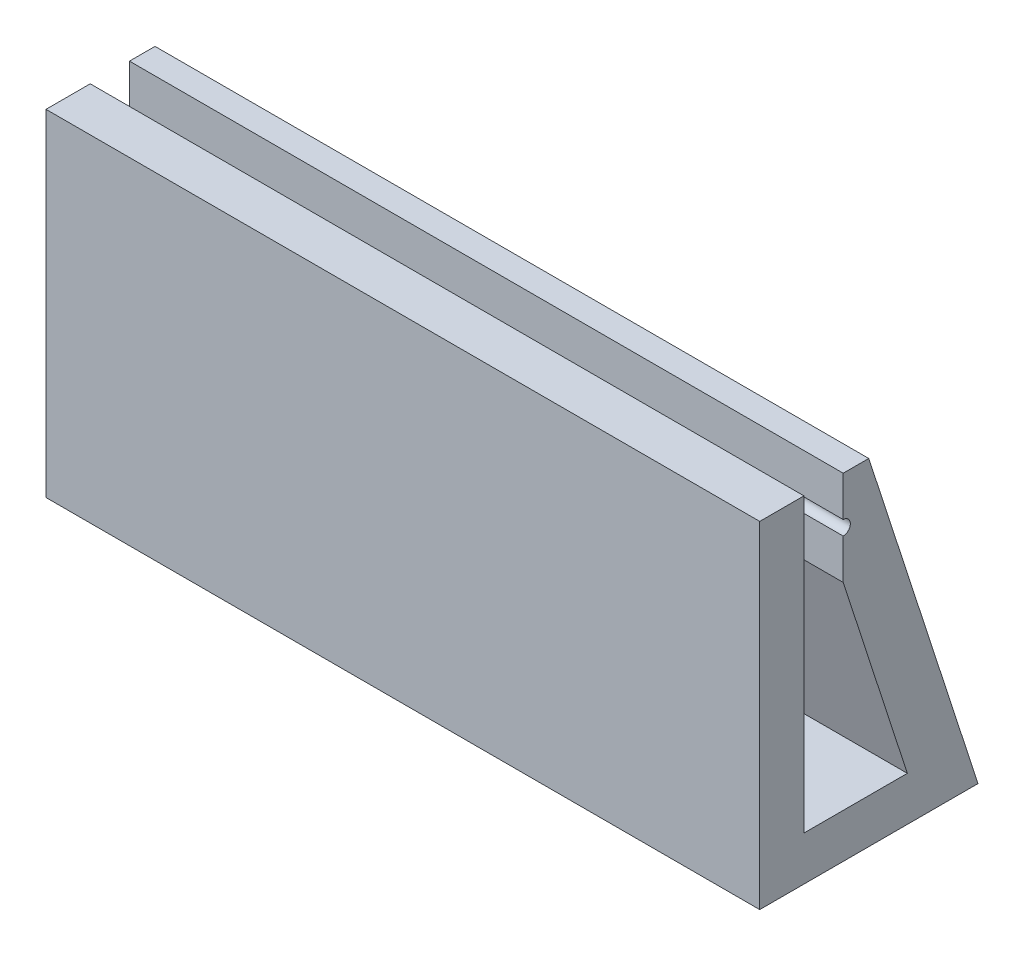
ISO-10303-21;
HEADER;
FILE_DESCRIPTION(('STEP AP214'),'2;1');
FILE_NAME('part.step','',(''),(''),'','','');
FILE_SCHEMA(('AUTOMOTIVE_DESIGN { 1 0 10303 214 1 1 1 1 }'));
ENDSEC;
DATA;
#1=APPLICATION_CONTEXT('core data for automotive mechanical design processes');
#2=APPLICATION_PROTOCOL_DEFINITION('international standard','automotive_design',2000,#1);
#3=PRODUCT_CONTEXT('',#1,'mechanical');
#4=PRODUCT('Part','Part','',(#3));
#5=PRODUCT_RELATED_PRODUCT_CATEGORY('part','',(#4));
#6=PRODUCT_DEFINITION_FORMATION('','',#4);
#7=PRODUCT_DEFINITION_CONTEXT('part definition',#1,'design');
#8=PRODUCT_DEFINITION('design','',#6,#7);
#9=PRODUCT_DEFINITION_SHAPE('','',#8);
#10=(LENGTH_UNIT() NAMED_UNIT(*) SI_UNIT(.MILLI.,.METRE.));
#11=(NAMED_UNIT(*) PLANE_ANGLE_UNIT() SI_UNIT($,.RADIAN.));
#12=(NAMED_UNIT(*) SI_UNIT($,.STERADIAN.) SOLID_ANGLE_UNIT());
#13=UNCERTAINTY_MEASURE_WITH_UNIT(LENGTH_MEASURE(1.E-05),#10,'distance_accuracy_value','');
#14=(GEOMETRIC_REPRESENTATION_CONTEXT(3) GLOBAL_UNCERTAINTY_ASSIGNED_CONTEXT((#13)) GLOBAL_UNIT_ASSIGNED_CONTEXT((#10,
#11,#12)) REPRESENTATION_CONTEXT('',''));
#15=CARTESIAN_POINT('',(0.,0.,0.));
#16=DIRECTION('',(0.,0.,1.));
#17=DIRECTION('',(1.,0.,0.));
#18=AXIS2_PLACEMENT_3D('',#15,#16,#17);
#19=CARTESIAN_POINT('',(10.,9.42163376503082,-2.33918131269569));
#20=DIRECTION('',(0.,1.,0.));
#21=DIRECTION('',(0.,0.,1.));
#22=AXIS2_PLACEMENT_3D('',#19,#20,#21);
#23=PLANE('',#22);
#24=DIRECTION('',(0.,0.,-1.));
#25=VECTOR('',#24,1.);
#26=CARTESIAN_POINT('',(-10.,9.42163376503082,-2.33918131269569));
#27=LINE('',#26,#25);
#28=CARTESIAN_POINT('',(-10.,9.42163376503082,-2.33918131269569));
#29=VERTEX_POINT('',#28);
#30=CARTESIAN_POINT('',(-10.,9.42163376503082,-3.05514481383585));
#31=VERTEX_POINT('',#30);
#32=EDGE_CURVE('E150',#29,#31,#27,.T.);
#33=ORIENTED_EDGE('',*,*,#32,.F.);
#34=DIRECTION('',(-1.,0.,0.));
#35=VECTOR('',#34,1.);
#36=CARTESIAN_POINT('',(10.,9.42163376503082,-2.33918131269569));
#37=LINE('',#36,#35);
#38=CARTESIAN_POINT('',(10.,9.42163376503082,-2.33918131269569));
#39=VERTEX_POINT('',#38);
#40=EDGE_CURVE('E11',#39,#29,#37,.T.);
#41=ORIENTED_EDGE('',*,*,#40,.F.);
#42=DIRECTION('',(0.,0.,-1.));
#43=VECTOR('',#42,1.);
#44=CARTESIAN_POINT('',(10.,9.42163376503082,-2.33918131269569));
#45=LINE('',#44,#43);
#46=CARTESIAN_POINT('',(10.,9.42163376503082,-3.05514481383585));
#47=VERTEX_POINT('',#46);
#48=EDGE_CURVE('E172',#39,#47,#45,.T.);
#49=ORIENTED_EDGE('',*,*,#48,.T.);
#50=DIRECTION('',(-1.,0.,0.));
#51=VECTOR('',#50,1.);
#52=CARTESIAN_POINT('',(10.,9.42163376503082,-3.05514481383585));
#53=LINE('',#52,#51);
#54=EDGE_CURVE('E37',#47,#31,#53,.T.);
#55=ORIENTED_EDGE('',*,*,#54,.T.);
#56=EDGE_LOOP('',(#33,#41,#49,#55));
#57=FACE_BOUND('',#56,.T.);
#58=ADVANCED_FACE('F34',(#57),#23,.T.);
#59=CARTESIAN_POINT('',(10.,9.42163376503082,-2.33918131269569));
#60=DIRECTION('',(0.,0.,-1.));
#61=DIRECTION('',(-1.,0.,0.));
#62=AXIS2_PLACEMENT_3D('',#59,#60,#61);
#63=PLANE('',#62);
#64=DIRECTION('',(0.,-1.,0.));
#65=VECTOR('',#64,1.);
#66=CARTESIAN_POINT('',(-10.,9.42163376503082,-2.33918131269569));
#67=LINE('',#66,#65);
#68=CARTESIAN_POINT('',(-10.,8.29633732224469,-2.33918131269569));
#69=VERTEX_POINT('',#68);
#70=EDGE_CURVE('E88',#29,#69,#67,.T.);
#71=ORIENTED_EDGE('',*,*,#70,.T.);
#72=DIRECTION('',(-1.,0.,0.));
#73=VECTOR('',#72,1.);
#74=CARTESIAN_POINT('',(10.,8.29633732224469,-2.33918131269569));
#75=LINE('',#74,#73);
#76=CARTESIAN_POINT('',(10.,8.29633732224469,-2.33918131269569));
#77=VERTEX_POINT('',#76);
#78=EDGE_CURVE('E43',#77,#69,#75,.T.);
#79=ORIENTED_EDGE('',*,*,#78,.F.);
#80=DIRECTION('',(0.,-1.,0.));
#81=VECTOR('',#80,1.);
#82=CARTESIAN_POINT('',(10.,9.42163376503082,-2.33918131269569));
#83=LINE('',#82,#81);
#84=EDGE_CURVE('E128',#39,#77,#83,.T.);
#85=ORIENTED_EDGE('',*,*,#84,.F.);
#86=ORIENTED_EDGE('',*,*,#40,.T.);
#87=EDGE_LOOP('',(#71,#79,#85,#86));
#88=FACE_BOUND('',#87,.T.);
#89=ADVANCED_FACE('F243',(#88),#63,.F.);
#90=CARTESIAN_POINT('',(10.,8.09633732224468,-2.33918131269569));
#91=DIRECTION('',(-1.,0.,0.));
#92=DIRECTION('',(0.,0.,1.));
#93=AXIS2_PLACEMENT_3D('',#90,#91,#92);
#94=CYLINDRICAL_SURFACE('',#93,0.200000000000001);
#95=CARTESIAN_POINT('',(-10.,8.09633732224468,-2.33918131269569));
#96=DIRECTION('',(-1.,0.,0.));
#97=DIRECTION('',(0.,0.,1.));
#98=AXIS2_PLACEMENT_3D('',#95,#96,#97);
#99=CIRCLE('',#98,0.200000000000001);
#100=CARTESIAN_POINT('',(-10.,7.89633732224468,-2.33918131269569));
#101=VERTEX_POINT('',#100);
#102=EDGE_CURVE('E135',#69,#101,#99,.T.);
#103=ORIENTED_EDGE('',*,*,#102,.T.);
#104=DIRECTION('',(-1.,0.,0.));
#105=VECTOR('',#104,1.);
#106=CARTESIAN_POINT('',(10.,7.89633732224468,-2.33918131269569));
#107=LINE('',#106,#105);
#108=CARTESIAN_POINT('',(10.,7.89633732224468,-2.33918131269569));
#109=VERTEX_POINT('',#108);
#110=EDGE_CURVE('E132',#109,#101,#107,.T.);
#111=ORIENTED_EDGE('',*,*,#110,.F.);
#112=CARTESIAN_POINT('',(10.,8.09633732224468,-2.33918131269569));
#113=DIRECTION('',(-1.,0.,0.));
#114=DIRECTION('',(0.,0.,1.));
#115=AXIS2_PLACEMENT_3D('',#112,#113,#114);
#116=CIRCLE('',#115,0.200000000000001);
#117=EDGE_CURVE('E121',#77,#109,#116,.T.);
#118=ORIENTED_EDGE('',*,*,#117,.F.);
#119=ORIENTED_EDGE('',*,*,#78,.T.);
#120=EDGE_LOOP('',(#103,#111,#118,#119));
#121=FACE_BOUND('',#120,.T.);
#122=ADVANCED_FACE('F133',(#121),#94,.F.);
#123=CARTESIAN_POINT('',(10.,7.89633732224468,-2.33918131269569));
#124=DIRECTION('',(0.,0.,-1.));
#125=DIRECTION('',(0.,1.,0.));
#126=AXIS2_PLACEMENT_3D('',#123,#124,#125);
#127=PLANE('',#126);
#128=DIRECTION('',(0.,-1.,0.));
#129=VECTOR('',#128,1.);
#130=CARTESIAN_POINT('',(-10.,7.89633732224468,-2.33918131269569));
#131=LINE('',#130,#129);
#132=CARTESIAN_POINT('',(-10.,6.77104087945855,-2.33918131269569));
#133=VERTEX_POINT('',#132);
#134=EDGE_CURVE('E169',#101,#133,#131,.T.);
#135=ORIENTED_EDGE('',*,*,#134,.T.);
#136=DIRECTION('',(-1.,0.,0.));
#137=VECTOR('',#136,1.);
#138=CARTESIAN_POINT('',(10.,6.77104087945855,-2.33918131269569));
#139=LINE('',#138,#137);
#140=CARTESIAN_POINT('',(10.,6.77104087945855,-2.33918131269569));
#141=VERTEX_POINT('',#140);
#142=EDGE_CURVE('E138',#141,#133,#139,.T.);
#143=ORIENTED_EDGE('',*,*,#142,.F.);
#144=DIRECTION('',(0.,-1.,0.));
#145=VECTOR('',#144,1.);
#146=CARTESIAN_POINT('',(10.,7.89633732224468,-2.33918131269569));
#147=LINE('',#146,#145);
#148=EDGE_CURVE('E126',#109,#141,#147,.T.);
#149=ORIENTED_EDGE('',*,*,#148,.F.);
#150=ORIENTED_EDGE('',*,*,#110,.T.);
#151=EDGE_LOOP('',(#135,#143,#149,#150));
#152=FACE_BOUND('',#151,.T.);
#153=ADVANCED_FACE('F140',(#152),#127,.F.);
#154=CARTESIAN_POINT('',(10.,6.77104087945855,-2.33918131269569));
#155=DIRECTION('',(0.,0.309016994374945,-0.951056516295155));
#156=DIRECTION('',(0.,0.951056516295155,0.309016994374945));
#157=AXIS2_PLACEMENT_3D('',#154,#155,#156);
#158=PLANE('',#157);
#159=DIRECTION('',(0.,-0.951056516295154,-0.309016994374945));
#160=VECTOR('',#159,1.);
#161=CARTESIAN_POINT('',(-10.,6.77104087945855,-2.33918131269569));
#162=LINE('',#161,#160);
#163=CARTESIAN_POINT('',(-10.,1.23918131269569,-4.13659144273136));
#164=VERTEX_POINT('',#163);
#165=EDGE_CURVE('E167',#133,#164,#162,.T.);
#166=ORIENTED_EDGE('',*,*,#165,.T.);
#167=DIRECTION('',(-1.,0.,0.));
#168=VECTOR('',#167,1.);
#169=CARTESIAN_POINT('',(10.,1.23918131269569,-4.13659144273136));
#170=LINE('',#169,#168);
#171=CARTESIAN_POINT('',(10.,1.23918131269569,-4.13659144273136));
#172=VERTEX_POINT('',#171);
#173=EDGE_CURVE('E176',#172,#164,#170,.T.);
#174=ORIENTED_EDGE('',*,*,#173,.F.);
#175=DIRECTION('',(0.,-0.951056516295154,-0.309016994374945));
#176=VECTOR('',#175,1.);
#177=CARTESIAN_POINT('',(10.,6.77104087945855,-2.33918131269569));
#178=LINE('',#177,#176);
#179=EDGE_CURVE('E143',#141,#172,#178,.T.);
#180=ORIENTED_EDGE('',*,*,#179,.F.);
#181=ORIENTED_EDGE('',*,*,#142,.T.);
#182=EDGE_LOOP('',(#166,#174,#180,#181));
#183=FACE_BOUND('',#182,.T.);
#184=ADVANCED_FACE('F199',(#183),#158,.F.);
#185=CARTESIAN_POINT('',(10.,1.23918131269569,-4.13659144273136));
#186=DIRECTION('',(0.,-1.,0.));
#187=DIRECTION('',(0.,0.,-1.));
#188=AXIS2_PLACEMENT_3D('',#185,#186,#187);
#189=PLANE('',#188);
#190=DIRECTION('',(0.,0.,1.));
#191=VECTOR('',#190,1.);
#192=CARTESIAN_POINT('',(-10.,1.23918131269569,-4.13659144273136));
#193=LINE('',#192,#191);
#194=CARTESIAN_POINT('',(-10.,1.23918131269569,-1.23918131269569));
#195=VERTEX_POINT('',#194);
#196=EDGE_CURVE('E165',#164,#195,#193,.T.);
#197=ORIENTED_EDGE('',*,*,#196,.T.);
#198=DIRECTION('',(-1.,0.,0.));
#199=VECTOR('',#198,1.);
#200=CARTESIAN_POINT('',(10.,1.23918131269569,-1.23918131269569));
#201=LINE('',#200,#199);
#202=CARTESIAN_POINT('',(10.,1.23918131269569,-1.23918131269569));
#203=VERTEX_POINT('',#202);
#204=EDGE_CURVE('E179',#203,#195,#201,.T.);
#205=ORIENTED_EDGE('',*,*,#204,.F.);
#206=DIRECTION('',(0.,0.,1.));
#207=VECTOR('',#206,1.);
#208=CARTESIAN_POINT('',(10.,1.23918131269569,-4.13659144273136));
#209=LINE('',#208,#207);
#210=EDGE_CURVE('E145',#172,#203,#209,.T.);
#211=ORIENTED_EDGE('',*,*,#210,.F.);
#212=ORIENTED_EDGE('',*,*,#173,.T.);
#213=EDGE_LOOP('',(#197,#205,#211,#212));
#214=FACE_BOUND('',#213,.T.);
#215=ADVANCED_FACE('F207',(#214),#189,.F.);
#216=CARTESIAN_POINT('',(10.,1.23918131269569,-1.23918131269569));
#217=DIRECTION('',(0.,0.,1.));
#218=DIRECTION('',(1.,0.,0.));
#219=AXIS2_PLACEMENT_3D('',#216,#217,#218);
#220=PLANE('',#219);
#221=DIRECTION('',(0.,1.,0.));
#222=VECTOR('',#221,1.);
#223=CARTESIAN_POINT('',(-10.,1.23918131269569,-1.23918131269569));
#224=LINE('',#223,#222);
#225=CARTESIAN_POINT('',(-10.,9.42163376503082,-1.23918131269569));
#226=VERTEX_POINT('',#225);
#227=EDGE_CURVE('E163',#195,#226,#224,.T.);
#228=ORIENTED_EDGE('',*,*,#227,.T.);
#229=DIRECTION('',(-1.,0.,0.));
#230=VECTOR('',#229,1.);
#231=CARTESIAN_POINT('',(10.,9.42163376503082,-1.23918131269569));
#232=LINE('',#231,#230);
#233=CARTESIAN_POINT('',(10.,9.42163376503082,-1.23918131269569));
#234=VERTEX_POINT('',#233);
#235=EDGE_CURVE('E182',#234,#226,#232,.T.);
#236=ORIENTED_EDGE('',*,*,#235,.F.);
#237=DIRECTION('',(0.,1.,0.));
#238=VECTOR('',#237,1.);
#239=CARTESIAN_POINT('',(10.,1.23918131269569,-1.23918131269569));
#240=LINE('',#239,#238);
#241=EDGE_CURVE('E204',#203,#234,#240,.T.);
#242=ORIENTED_EDGE('',*,*,#241,.F.);
#243=ORIENTED_EDGE('',*,*,#204,.T.);
#244=EDGE_LOOP('',(#228,#236,#242,#243));
#245=FACE_BOUND('',#244,.T.);
#246=ADVANCED_FACE('F210',(#245),#220,.F.);
#247=CARTESIAN_POINT('',(10.,9.42163376503082,-1.23918131269569));
#248=DIRECTION('',(0.,-1.,0.));
#249=DIRECTION('',(0.,0.,-1.));
#250=AXIS2_PLACEMENT_3D('',#247,#248,#249);
#251=PLANE('',#250);
#252=DIRECTION('',(0.,0.,1.));
#253=VECTOR('',#252,1.);
#254=CARTESIAN_POINT('',(-10.,9.42163376503082,-1.23918131269569));
#255=LINE('',#254,#253);
#256=CARTESIAN_POINT('',(-10.,9.42163376503082,0.));
#257=VERTEX_POINT('',#256);
#258=EDGE_CURVE('E161',#226,#257,#255,.T.);
#259=ORIENTED_EDGE('',*,*,#258,.T.);
#260=DIRECTION('',(-1.,0.,0.));
#261=VECTOR('',#260,1.);
#262=CARTESIAN_POINT('',(10.,9.42163376503082,0.));
#263=LINE('',#262,#261);
#264=CARTESIAN_POINT('',(10.,9.42163376503082,0.));
#265=VERTEX_POINT('',#264);
#266=EDGE_CURVE('E185',#265,#257,#263,.T.);
#267=ORIENTED_EDGE('',*,*,#266,.F.);
#268=DIRECTION('',(0.,0.,1.));
#269=VECTOR('',#268,1.);
#270=CARTESIAN_POINT('',(10.,9.42163376503082,-1.23918131269569));
#271=LINE('',#270,#269);
#272=EDGE_CURVE('E212',#234,#265,#271,.T.);
#273=ORIENTED_EDGE('',*,*,#272,.F.);
#274=ORIENTED_EDGE('',*,*,#235,.T.);
#275=EDGE_LOOP('',(#259,#267,#273,#274));
#276=FACE_BOUND('',#275,.T.);
#277=ADVANCED_FACE('F233',(#276),#251,.F.);
#278=CARTESIAN_POINT('',(10.,9.42163376503082,0.));
#279=DIRECTION('',(0.,0.,-1.));
#280=DIRECTION('',(-1.,0.,0.));
#281=AXIS2_PLACEMENT_3D('',#278,#279,#280);
#282=PLANE('',#281);
#283=DIRECTION('',(0.,-1.,0.));
#284=VECTOR('',#283,1.);
#285=CARTESIAN_POINT('',(-10.,9.42163376503082,0.));
#286=LINE('',#285,#284);
#287=CARTESIAN_POINT('',(-10.,0.,0.));
#288=VERTEX_POINT('',#287);
#289=EDGE_CURVE('E159',#257,#288,#286,.T.);
#290=ORIENTED_EDGE('',*,*,#289,.T.);
#291=DIRECTION('',(-1.,0.,0.));
#292=VECTOR('',#291,1.);
#293=CARTESIAN_POINT('',(10.,0.,0.));
#294=LINE('',#293,#292);
#295=CARTESIAN_POINT('',(10.,0.,0.));
#296=VERTEX_POINT('',#295);
#297=EDGE_CURVE('E188',#296,#288,#294,.T.);
#298=ORIENTED_EDGE('',*,*,#297,.F.);
#299=DIRECTION('',(0.,-1.,0.));
#300=VECTOR('',#299,1.);
#301=CARTESIAN_POINT('',(10.,9.42163376503082,0.));
#302=LINE('',#301,#300);
#303=EDGE_CURVE('E214',#265,#296,#302,.T.);
#304=ORIENTED_EDGE('',*,*,#303,.F.);
#305=ORIENTED_EDGE('',*,*,#266,.T.);
#306=EDGE_LOOP('',(#290,#298,#304,#305));
#307=FACE_BOUND('',#306,.T.);
#308=ADVANCED_FACE('F230',(#307),#282,.F.);
#309=CARTESIAN_POINT('',(10.,0.,0.));
#310=DIRECTION('',(0.,1.,0.));
#311=DIRECTION('',(0.,0.,1.));
#312=AXIS2_PLACEMENT_3D('',#309,#310,#311);
#313=PLANE('',#312);
#314=DIRECTION('',(0.,0.,-1.));
#315=VECTOR('',#314,1.);
#316=CARTESIAN_POINT('',(-10.,0.,0.));
#317=LINE('',#316,#315);
#318=CARTESIAN_POINT('',(-10.,0.,-6.11641919478733));
#319=VERTEX_POINT('',#318);
#320=EDGE_CURVE('E156',#288,#319,#317,.T.);
#321=ORIENTED_EDGE('',*,*,#320,.T.);
#322=DIRECTION('',(-1.,0.,0.));
#323=VECTOR('',#322,1.);
#324=CARTESIAN_POINT('',(10.,0.,-6.11641919478733));
#325=LINE('',#324,#323);
#326=CARTESIAN_POINT('',(10.,0.,-6.11641919478733));
#327=VERTEX_POINT('',#326);
#328=EDGE_CURVE('E190',#327,#319,#325,.T.);
#329=ORIENTED_EDGE('',*,*,#328,.F.);
#330=DIRECTION('',(0.,0.,-1.));
#331=VECTOR('',#330,1.);
#332=CARTESIAN_POINT('',(10.,0.,0.));
#333=LINE('',#332,#331);
#334=EDGE_CURVE('E218',#296,#327,#333,.T.);
#335=ORIENTED_EDGE('',*,*,#334,.F.);
#336=ORIENTED_EDGE('',*,*,#297,.T.);
#337=EDGE_LOOP('',(#321,#329,#335,#336));
#338=FACE_BOUND('',#337,.T.);
#339=ADVANCED_FACE('F226',(#338),#313,.F.);
#340=CARTESIAN_POINT('',(10.,9.42163376503082,-3.05514481383585));
#341=DIRECTION('',(0.,0.309016994374945,-0.951056516295155));
#342=DIRECTION('',(0.,0.951056516295155,0.309016994374945));
#343=AXIS2_PLACEMENT_3D('',#340,#341,#342);
#344=PLANE('',#343);
#345=DIRECTION('',(0.,-0.951056516295154,-0.309016994374945));
#346=VECTOR('',#345,1.);
#347=CARTESIAN_POINT('',(-10.,9.42163376503082,-3.05514481383585));
#348=LINE('',#347,#346);
#349=EDGE_CURVE('E153',#31,#319,#348,.T.);
#350=ORIENTED_EDGE('',*,*,#349,.F.);
#351=ORIENTED_EDGE('',*,*,#54,.F.);
#352=DIRECTION('',(0.,-0.951056516295154,-0.309016994374945));
#353=VECTOR('',#352,1.);
#354=CARTESIAN_POINT('',(10.,9.42163376503082,-3.05514481383585));
#355=LINE('',#354,#353);
#356=EDGE_CURVE('E220',#47,#327,#355,.T.);
#357=ORIENTED_EDGE('',*,*,#356,.T.);
#358=ORIENTED_EDGE('',*,*,#328,.T.);
#359=EDGE_LOOP('',(#350,#351,#357,#358));
#360=FACE_BOUND('',#359,.T.);
#361=ADVANCED_FACE('F192',(#360),#344,.T.);
#362=CARTESIAN_POINT('',(10.,8.09633732224468,-2.33918131269569));
#363=DIRECTION('',(-1.,0.,0.));
#364=DIRECTION('',(0.,0.,1.));
#365=AXIS2_PLACEMENT_3D('',#362,#363,#364);
#366=PLANE('',#365);
#367=ORIENTED_EDGE('',*,*,#48,.F.);
#368=ORIENTED_EDGE('',*,*,#84,.T.);
#369=ORIENTED_EDGE('',*,*,#117,.T.);
#370=ORIENTED_EDGE('',*,*,#148,.T.);
#371=ORIENTED_EDGE('',*,*,#179,.T.);
#372=ORIENTED_EDGE('',*,*,#210,.T.);
#373=ORIENTED_EDGE('',*,*,#241,.T.);
#374=ORIENTED_EDGE('',*,*,#272,.T.);
#375=ORIENTED_EDGE('',*,*,#303,.T.);
#376=ORIENTED_EDGE('',*,*,#334,.T.);
#377=ORIENTED_EDGE('',*,*,#356,.F.);
#378=EDGE_LOOP('',(#367,#368,#369,#370,#371,#372,#373,#374,#375,#376,#377));
#379=FACE_BOUND('',#378,.T.);
#380=ADVANCED_FACE('F124',(#379),#366,.F.);
#381=CARTESIAN_POINT('',(-10.,8.09633732224468,-2.33918131269569));
#382=DIRECTION('',(-1.,0.,0.));
#383=DIRECTION('',(0.,0.,1.));
#384=AXIS2_PLACEMENT_3D('',#381,#382,#383);
#385=PLANE('',#384);
#386=ORIENTED_EDGE('',*,*,#32,.T.);
#387=ORIENTED_EDGE('',*,*,#349,.T.);
#388=ORIENTED_EDGE('',*,*,#320,.F.);
#389=ORIENTED_EDGE('',*,*,#289,.F.);
#390=ORIENTED_EDGE('',*,*,#258,.F.);
#391=ORIENTED_EDGE('',*,*,#227,.F.);
#392=ORIENTED_EDGE('',*,*,#196,.F.);
#393=ORIENTED_EDGE('',*,*,#165,.F.);
#394=ORIENTED_EDGE('',*,*,#134,.F.);
#395=ORIENTED_EDGE('',*,*,#102,.F.);
#396=ORIENTED_EDGE('',*,*,#70,.F.);
#397=EDGE_LOOP('',(#386,#387,#388,#389,#390,#391,#392,#393,#394,#395,#396));
#398=FACE_BOUND('',#397,.T.);
#399=ADVANCED_FACE('F195',(#398),#385,.T.);
#400=CLOSED_SHELL('',(#58,#89,#122,#153,#184,#215,#246,#277,#308,#339,#361,#380,#399));
#401=MANIFOLD_SOLID_BREP('B2',#400);
#402=ADVANCED_BREP_SHAPE_REPRESENTATION('',(#18,#401),#14);
#403=SHAPE_DEFINITION_REPRESENTATION(#9,#402);
ENDSEC;
END-ISO-10303-21;
